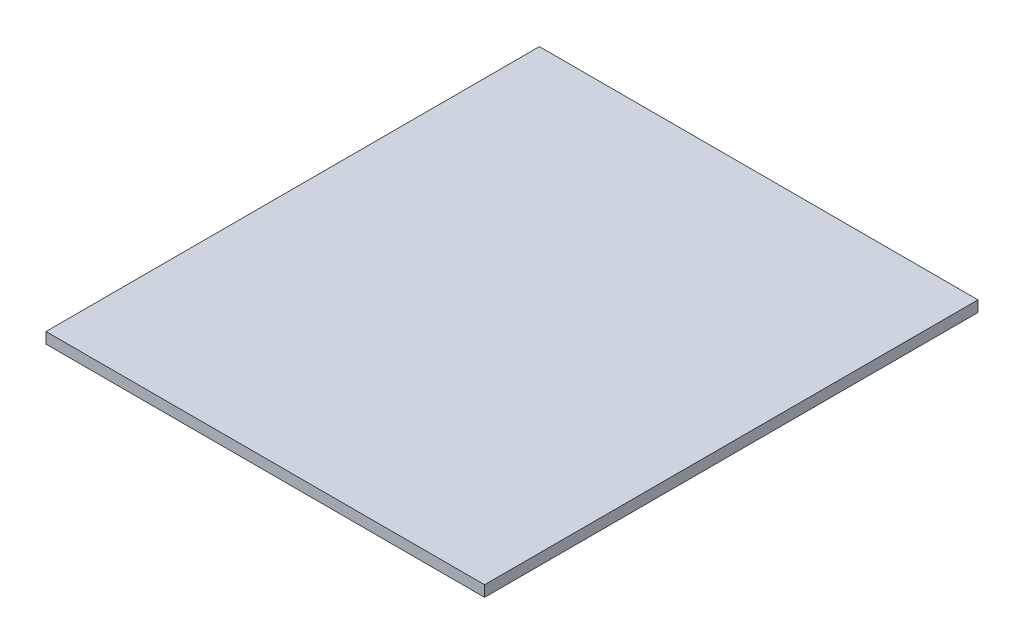
ISO-10303-21;
HEADER;
FILE_DESCRIPTION(('STEP AP214'),'2;1');
FILE_NAME('part.step','',(''),(''),'','','');
FILE_SCHEMA(('AUTOMOTIVE_DESIGN { 1 0 10303 214 1 1 1 1 }'));
ENDSEC;
DATA;
#1=APPLICATION_CONTEXT('core data for automotive mechanical design processes');
#2=APPLICATION_PROTOCOL_DEFINITION('international standard','automotive_design',2000,#1);
#3=PRODUCT_CONTEXT('',#1,'mechanical');
#4=PRODUCT('Part','Part','',(#3));
#5=PRODUCT_RELATED_PRODUCT_CATEGORY('part','',(#4));
#6=PRODUCT_DEFINITION_FORMATION('','',#4);
#7=PRODUCT_DEFINITION_CONTEXT('part definition',#1,'design');
#8=PRODUCT_DEFINITION('design','',#6,#7);
#9=PRODUCT_DEFINITION_SHAPE('','',#8);
#10=(LENGTH_UNIT() NAMED_UNIT(*) SI_UNIT(.MILLI.,.METRE.));
#11=(NAMED_UNIT(*) PLANE_ANGLE_UNIT() SI_UNIT($,.RADIAN.));
#12=(NAMED_UNIT(*) SI_UNIT($,.STERADIAN.) SOLID_ANGLE_UNIT());
#13=UNCERTAINTY_MEASURE_WITH_UNIT(LENGTH_MEASURE(1.E-05),#10,'distance_accuracy_value','');
#14=(GEOMETRIC_REPRESENTATION_CONTEXT(3) GLOBAL_UNCERTAINTY_ASSIGNED_CONTEXT((#13)) GLOBAL_UNIT_ASSIGNED_CONTEXT((#10,
#11,#12)) REPRESENTATION_CONTEXT('',''));
#15=CARTESIAN_POINT('',(0.,0.,0.));
#16=DIRECTION('',(0.,0.,1.));
#17=DIRECTION('',(1.,0.,0.));
#18=AXIS2_PLACEMENT_3D('',#15,#16,#17);
#19=CARTESIAN_POINT('',(0.,10.,0.));
#20=DIRECTION('',(-1.,0.,0.));
#21=DIRECTION('',(0.,0.,1.));
#22=AXIS2_PLACEMENT_3D('',#19,#20,#21);
#23=PLANE('',#22);
#24=DIRECTION('',(0.,0.,-1.));
#25=VECTOR('',#24,1.);
#26=CARTESIAN_POINT('',(0.,0.,0.));
#27=LINE('',#26,#25);
#28=CARTESIAN_POINT('',(0.,0.,0.));
#29=VERTEX_POINT('',#28);
#30=CARTESIAN_POINT('',(0.,0.,-450.));
#31=VERTEX_POINT('',#30);
#32=EDGE_CURVE('E95',#29,#31,#27,.T.);
#33=ORIENTED_EDGE('',*,*,#32,.T.);
#34=DIRECTION('',(0.,-1.,0.));
#35=VECTOR('',#34,1.);
#36=CARTESIAN_POINT('',(0.,10.,-450.));
#37=LINE('',#36,#35);
#38=CARTESIAN_POINT('',(0.,10.,-450.));
#39=VERTEX_POINT('',#38);
#40=EDGE_CURVE('E11',#39,#31,#37,.T.);
#41=ORIENTED_EDGE('',*,*,#40,.F.);
#42=DIRECTION('',(0.,0.,-1.));
#43=VECTOR('',#42,1.);
#44=CARTESIAN_POINT('',(0.,10.,0.));
#45=LINE('',#44,#43);
#46=CARTESIAN_POINT('',(0.,10.,0.));
#47=VERTEX_POINT('',#46);
#48=EDGE_CURVE('E83',#47,#39,#45,.T.);
#49=ORIENTED_EDGE('',*,*,#48,.F.);
#50=DIRECTION('',(0.,-1.,0.));
#51=VECTOR('',#50,1.);
#52=CARTESIAN_POINT('',(0.,10.,0.));
#53=LINE('',#52,#51);
#54=EDGE_CURVE('E91',#47,#29,#53,.T.);
#55=ORIENTED_EDGE('',*,*,#54,.T.);
#56=EDGE_LOOP('',(#33,#41,#49,#55));
#57=FACE_BOUND('',#56,.T.);
#58=ADVANCED_FACE('F32',(#57),#23,.F.);
#59=CARTESIAN_POINT('',(0.,10.,-450.));
#60=DIRECTION('',(0.,0.,1.));
#61=DIRECTION('',(1.,0.,0.));
#62=AXIS2_PLACEMENT_3D('',#59,#60,#61);
#63=PLANE('',#62);
#64=DIRECTION('',(-1.,0.,0.));
#65=VECTOR('',#64,1.);
#66=CARTESIAN_POINT('',(0.,0.,-450.));
#67=LINE('',#66,#65);
#68=CARTESIAN_POINT('',(-400.,0.,-450.));
#69=VERTEX_POINT('',#68);
#70=EDGE_CURVE('E87',#31,#69,#67,.T.);
#71=ORIENTED_EDGE('',*,*,#70,.T.);
#72=DIRECTION('',(0.,-1.,0.));
#73=VECTOR('',#72,1.);
#74=CARTESIAN_POINT('',(-400.,10.,-450.));
#75=LINE('',#74,#73);
#76=CARTESIAN_POINT('',(-400.,10.,-450.));
#77=VERTEX_POINT('',#76);
#78=EDGE_CURVE('E40',#77,#69,#75,.T.);
#79=ORIENTED_EDGE('',*,*,#78,.F.);
#80=DIRECTION('',(-1.,0.,0.));
#81=VECTOR('',#80,1.);
#82=CARTESIAN_POINT('',(0.,10.,-450.));
#83=LINE('',#82,#81);
#84=EDGE_CURVE('E78',#39,#77,#83,.T.);
#85=ORIENTED_EDGE('',*,*,#84,.F.);
#86=ORIENTED_EDGE('',*,*,#40,.T.);
#87=EDGE_LOOP('',(#71,#79,#85,#86));
#88=FACE_BOUND('',#87,.T.);
#89=ADVANCED_FACE('F86',(#88),#63,.F.);
#90=CARTESIAN_POINT('',(-400.,10.,0.));
#91=DIRECTION('',(1.,0.,0.));
#92=DIRECTION('',(0.,0.,-1.));
#93=AXIS2_PLACEMENT_3D('',#90,#91,#92);
#94=PLANE('',#93);
#95=DIRECTION('',(0.,0.,1.));
#96=VECTOR('',#95,1.);
#97=CARTESIAN_POINT('',(-400.,0.,0.));
#98=LINE('',#97,#96);
#99=CARTESIAN_POINT('',(-400.,0.,0.));
#100=VERTEX_POINT('',#99);
#101=EDGE_CURVE('E65',#69,#100,#98,.T.);
#102=ORIENTED_EDGE('',*,*,#101,.T.);
#103=DIRECTION('',(0.,-1.,0.));
#104=VECTOR('',#103,1.);
#105=CARTESIAN_POINT('',(-400.,10.,0.));
#106=LINE('',#105,#104);
#107=CARTESIAN_POINT('',(-400.,10.,0.));
#108=VERTEX_POINT('',#107);
#109=EDGE_CURVE('E88',#108,#100,#106,.T.);
#110=ORIENTED_EDGE('',*,*,#109,.F.);
#111=DIRECTION('',(0.,0.,1.));
#112=VECTOR('',#111,1.);
#113=CARTESIAN_POINT('',(-400.,10.,0.));
#114=LINE('',#113,#112);
#115=EDGE_CURVE('E81',#77,#108,#114,.T.);
#116=ORIENTED_EDGE('',*,*,#115,.F.);
#117=ORIENTED_EDGE('',*,*,#78,.T.);
#118=EDGE_LOOP('',(#102,#110,#116,#117));
#119=FACE_BOUND('',#118,.T.);
#120=ADVANCED_FACE('F89',(#119),#94,.F.);
#121=CARTESIAN_POINT('',(0.,10.,0.));
#122=DIRECTION('',(0.,0.,-1.));
#123=DIRECTION('',(-1.,0.,0.));
#124=AXIS2_PLACEMENT_3D('',#121,#122,#123);
#125=PLANE('',#124);
#126=DIRECTION('',(1.,0.,0.));
#127=VECTOR('',#126,1.);
#128=CARTESIAN_POINT('',(0.,0.,0.));
#129=LINE('',#128,#127);
#130=EDGE_CURVE('E71',#100,#29,#129,.T.);
#131=ORIENTED_EDGE('',*,*,#130,.T.);
#132=ORIENTED_EDGE('',*,*,#54,.F.);
#133=DIRECTION('',(1.,0.,0.));
#134=VECTOR('',#133,1.);
#135=CARTESIAN_POINT('',(0.,10.,0.));
#136=LINE('',#135,#134);
#137=EDGE_CURVE('E48',#108,#47,#136,.T.);
#138=ORIENTED_EDGE('',*,*,#137,.F.);
#139=ORIENTED_EDGE('',*,*,#109,.T.);
#140=EDGE_LOOP('',(#131,#132,#138,#139));
#141=FACE_BOUND('',#140,.T.);
#142=ADVANCED_FACE('F102',(#141),#125,.F.);
#143=CARTESIAN_POINT('',(0.,10.,0.));
#144=DIRECTION('',(0.,1.,0.));
#145=DIRECTION('',(0.,0.,1.));
#146=AXIS2_PLACEMENT_3D('',#143,#144,#145);
#147=PLANE('',#146);
#148=ORIENTED_EDGE('',*,*,#48,.T.);
#149=ORIENTED_EDGE('',*,*,#84,.T.);
#150=ORIENTED_EDGE('',*,*,#115,.T.);
#151=ORIENTED_EDGE('',*,*,#137,.T.);
#152=EDGE_LOOP('',(#148,#149,#150,#151));
#153=FACE_BOUND('',#152,.T.);
#154=ADVANCED_FACE('F79',(#153),#147,.T.);
#155=CARTESIAN_POINT('',(0.,0.,0.));
#156=DIRECTION('',(0.,1.,0.));
#157=DIRECTION('',(0.,0.,1.));
#158=AXIS2_PLACEMENT_3D('',#155,#156,#157);
#159=PLANE('',#158);
#160=ORIENTED_EDGE('',*,*,#32,.F.);
#161=ORIENTED_EDGE('',*,*,#130,.F.);
#162=ORIENTED_EDGE('',*,*,#101,.F.);
#163=ORIENTED_EDGE('',*,*,#70,.F.);
#164=EDGE_LOOP('',(#160,#161,#162,#163));
#165=FACE_BOUND('',#164,.T.);
#166=ADVANCED_FACE('F105',(#165),#159,.F.);
#167=CLOSED_SHELL('',(#58,#89,#120,#142,#154,#166));
#168=MANIFOLD_SOLID_BREP('B2',#167);
#169=ADVANCED_BREP_SHAPE_REPRESENTATION('',(#18,#168),#14);
#170=SHAPE_DEFINITION_REPRESENTATION(#9,#169);
ENDSEC;
END-ISO-10303-21;
